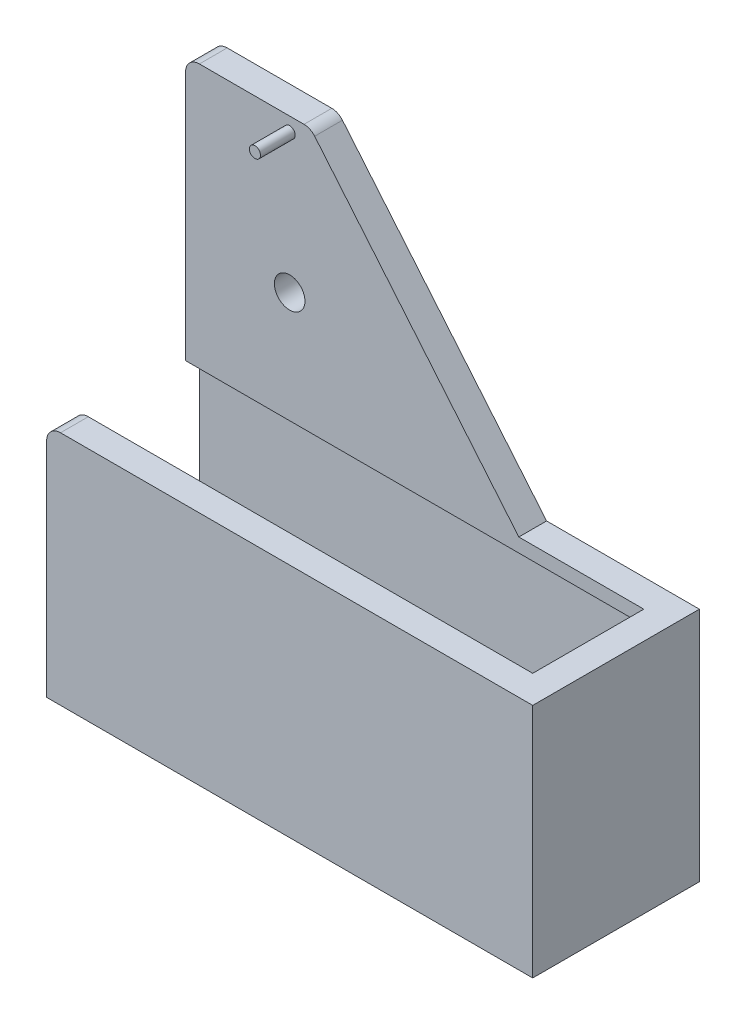
ISO-10303-21;
HEADER;
FILE_DESCRIPTION(('STEP AP214'),'2;1');
FILE_NAME('part.step','',(''),(''),'','','');
FILE_SCHEMA(('AUTOMOTIVE_DESIGN { 1 0 10303 214 1 1 1 1 }'));
ENDSEC;
DATA;
#1=APPLICATION_CONTEXT('core data for automotive mechanical design processes');
#2=APPLICATION_PROTOCOL_DEFINITION('international standard','automotive_design',2000,#1);
#3=PRODUCT_CONTEXT('',#1,'mechanical');
#4=PRODUCT('Part','Part','',(#3));
#5=PRODUCT_RELATED_PRODUCT_CATEGORY('part','',(#4));
#6=PRODUCT_DEFINITION_FORMATION('','',#4);
#7=PRODUCT_DEFINITION_CONTEXT('part definition',#1,'design');
#8=PRODUCT_DEFINITION('design','',#6,#7);
#9=PRODUCT_DEFINITION_SHAPE('','',#8);
#10=(LENGTH_UNIT() NAMED_UNIT(*) SI_UNIT(.MILLI.,.METRE.));
#11=(NAMED_UNIT(*) PLANE_ANGLE_UNIT() SI_UNIT($,.RADIAN.));
#12=(NAMED_UNIT(*) SI_UNIT($,.STERADIAN.) SOLID_ANGLE_UNIT());
#13=UNCERTAINTY_MEASURE_WITH_UNIT(LENGTH_MEASURE(1.E-05),#10,'distance_accuracy_value','');
#14=(GEOMETRIC_REPRESENTATION_CONTEXT(3) GLOBAL_UNCERTAINTY_ASSIGNED_CONTEXT((#13)) GLOBAL_UNIT_ASSIGNED_CONTEXT((#10,
#11,#12)) REPRESENTATION_CONTEXT('',''));
#15=CARTESIAN_POINT('',(0.,0.,0.));
#16=DIRECTION('',(0.,0.,1.));
#17=DIRECTION('',(1.,0.,0.));
#18=AXIS2_PLACEMENT_3D('',#15,#16,#17);
#19=CARTESIAN_POINT('',(0.,0.,0.));
#20=DIRECTION('',(0.,1.,0.));
#21=DIRECTION('',(0.,0.,1.));
#22=AXIS2_PLACEMENT_3D('',#19,#20,#21);
#23=PLANE('',#22);
#24=DIRECTION('',(0.,0.,1.));
#25=VECTOR('',#24,1.);
#26=CARTESIAN_POINT('',(-165.,0.,-60.));
#27=LINE('',#26,#25);
#28=CARTESIAN_POINT('',(-165.,0.,-50.));
#29=VERTEX_POINT('',#28);
#30=CARTESIAN_POINT('',(-165.,0.,50.));
#31=VERTEX_POINT('',#30);
#32=EDGE_CURVE('E220',#29,#31,#27,.T.);
#33=ORIENTED_EDGE('',*,*,#32,.F.);
#34=DIRECTION('',(1.,0.,0.));
#35=VECTOR('',#34,1.);
#36=CARTESIAN_POINT('',(-165.,0.,-50.));
#37=LINE('',#36,#35);
#38=CARTESIAN_POINT('',(135.,0.,-50.));
#39=VERTEX_POINT('',#38);
#40=EDGE_CURVE('E429',#29,#39,#37,.T.);
#41=ORIENTED_EDGE('',*,*,#40,.T.);
#42=DIRECTION('',(0.,0.,-1.));
#43=VECTOR('',#42,1.);
#44=CARTESIAN_POINT('',(135.,0.,50.));
#45=LINE('',#44,#43);
#46=CARTESIAN_POINT('',(135.,0.,50.));
#47=VERTEX_POINT('',#46);
#48=EDGE_CURVE('E473',#47,#39,#45,.T.);
#49=ORIENTED_EDGE('',*,*,#48,.F.);
#50=DIRECTION('',(-1.,0.,0.));
#51=VECTOR('',#50,1.);
#52=CARTESIAN_POINT('',(185.,0.,50.));
#53=LINE('',#52,#51);
#54=EDGE_CURVE('E245',#47,#31,#53,.T.);
#55=ORIENTED_EDGE('',*,*,#54,.T.);
#56=EDGE_LOOP('',(#33,#41,#49,#55));
#57=FACE_BOUND('',#56,.T.);
#58=ADVANCED_FACE('F39',(#57),#23,.F.);
#59=CARTESIAN_POINT('',(0.,120.,0.));
#60=DIRECTION('',(0.,1.,0.));
#61=DIRECTION('',(0.,0.,1.));
#62=AXIS2_PLACEMENT_3D('',#59,#60,#61);
#63=PLANE('',#62);
#64=DIRECTION('',(1.,0.,0.));
#65=VECTOR('',#64,1.);
#66=CARTESIAN_POINT('',(-165.,120.,40.));
#67=LINE('',#66,#65);
#68=CARTESIAN_POINT('',(-155.,120.,40.));
#69=VERTEX_POINT('',#68);
#70=CARTESIAN_POINT('',(165.,120.,40.));
#71=VERTEX_POINT('',#70);
#72=EDGE_CURVE('E303',#69,#71,#67,.T.);
#73=ORIENTED_EDGE('',*,*,#72,.F.);
#74=DIRECTION('',(0.,0.,1.));
#75=VECTOR('',#74,1.);
#76=CARTESIAN_POINT('',(-155.,120.,60.));
#77=LINE('',#76,#75);
#78=CARTESIAN_POINT('',(-155.,120.,60.));
#79=VERTEX_POINT('',#78);
#80=EDGE_CURVE('E259',#69,#79,#77,.T.);
#81=ORIENTED_EDGE('',*,*,#80,.T.);
#82=DIRECTION('',(1.,0.,0.));
#83=VECTOR('',#82,1.);
#84=CARTESIAN_POINT('',(-165.,120.,60.));
#85=LINE('',#84,#83);
#86=CARTESIAN_POINT('',(185.,120.,60.));
#87=VERTEX_POINT('',#86);
#88=EDGE_CURVE('E219',#79,#87,#85,.T.);
#89=ORIENTED_EDGE('',*,*,#88,.T.);
#90=DIRECTION('',(0.,0.,1.));
#91=VECTOR('',#90,1.);
#92=CARTESIAN_POINT('',(185.,120.,-60.));
#93=LINE('',#92,#91);
#94=CARTESIAN_POINT('',(185.,120.,-60.));
#95=VERTEX_POINT('',#94);
#96=EDGE_CURVE('E217',#95,#87,#93,.T.);
#97=ORIENTED_EDGE('',*,*,#96,.F.);
#98=DIRECTION('',(-1.,0.,0.));
#99=VECTOR('',#98,1.);
#100=CARTESIAN_POINT('',(-165.,120.,-60.));
#101=LINE('',#100,#99);
#102=CARTESIAN_POINT('',(75.,120.,-60.));
#103=VERTEX_POINT('',#102);
#104=EDGE_CURVE('E208',#95,#103,#101,.T.);
#105=ORIENTED_EDGE('',*,*,#104,.T.);
#106=DIRECTION('',(0.,0.,1.));
#107=VECTOR('',#106,1.);
#108=CARTESIAN_POINT('',(75.,120.,-60.));
#109=LINE('',#108,#107);
#110=CARTESIAN_POINT('',(75.,120.,-40.));
#111=VERTEX_POINT('',#110);
#112=EDGE_CURVE('E192',#103,#111,#109,.T.);
#113=ORIENTED_EDGE('',*,*,#112,.T.);
#114=DIRECTION('',(-1.,0.,0.));
#115=VECTOR('',#114,1.);
#116=CARTESIAN_POINT('',(-165.,120.,-40.));
#117=LINE('',#116,#115);
#118=CARTESIAN_POINT('',(165.,120.,-40.));
#119=VERTEX_POINT('',#118);
#120=EDGE_CURVE('E308',#119,#111,#117,.T.);
#121=ORIENTED_EDGE('',*,*,#120,.F.);
#122=DIRECTION('',(0.,0.,1.));
#123=VECTOR('',#122,1.);
#124=CARTESIAN_POINT('',(165.,120.,-60.));
#125=LINE('',#124,#123);
#126=EDGE_CURVE('E407',#119,#71,#125,.T.);
#127=ORIENTED_EDGE('',*,*,#126,.T.);
#128=EDGE_LOOP('',(#73,#81,#89,#97,#105,#113,#121,#127));
#129=FACE_BOUND('',#128,.T.);
#130=ADVANCED_FACE('F215',(#129),#63,.T.);
#131=CARTESIAN_POINT('',(-165.,110.,50.));
#132=DIRECTION('',(0.,-1.,0.));
#133=DIRECTION('',(0.,0.,-1.));
#134=AXIS2_PLACEMENT_3D('',#131,#132,#133);
#135=PLANE('',#134);
#136=DIRECTION('',(1.,0.,0.));
#137=VECTOR('',#136,1.);
#138=CARTESIAN_POINT('',(-165.,110.,40.));
#139=LINE('',#138,#137);
#140=CARTESIAN_POINT('',(-165.,110.,40.));
#141=VERTEX_POINT('',#140);
#142=CARTESIAN_POINT('',(165.,110.,40.));
#143=VERTEX_POINT('',#142);
#144=EDGE_CURVE('E314',#141,#143,#139,.T.);
#145=ORIENTED_EDGE('',*,*,#144,.T.);
#146=DIRECTION('',(0.,0.,-1.));
#147=VECTOR('',#146,1.);
#148=CARTESIAN_POINT('',(165.,110.,50.));
#149=LINE('',#148,#147);
#150=CARTESIAN_POINT('',(165.,110.,50.));
#151=VERTEX_POINT('',#150);
#152=EDGE_CURVE('E350',#151,#143,#149,.T.);
#153=ORIENTED_EDGE('',*,*,#152,.F.);
#154=DIRECTION('',(1.,0.,0.));
#155=VECTOR('',#154,1.);
#156=CARTESIAN_POINT('',(-165.,110.,50.));
#157=LINE('',#156,#155);
#158=CARTESIAN_POINT('',(-165.,110.,50.));
#159=VERTEX_POINT('',#158);
#160=EDGE_CURVE('E359',#159,#151,#157,.T.);
#161=ORIENTED_EDGE('',*,*,#160,.F.);
#162=DIRECTION('',(0.,0.,-1.));
#163=VECTOR('',#162,1.);
#164=CARTESIAN_POINT('',(-165.,110.,50.));
#165=LINE('',#164,#163);
#166=EDGE_CURVE('E338',#159,#141,#165,.T.);
#167=ORIENTED_EDGE('',*,*,#166,.T.);
#168=EDGE_LOOP('',(#145,#153,#161,#167));
#169=FACE_BOUND('',#168,.T.);
#170=ADVANCED_FACE('F398',(#169),#135,.T.);
#171=CARTESIAN_POINT('',(-165.,120.,-60.));
#172=DIRECTION('',(0.,0.,1.));
#173=DIRECTION('',(1.,0.,0.));
#174=AXIS2_PLACEMENT_3D('',#171,#172,#173);
#175=PLANE('',#174);
#176=DIRECTION('',(0.,-1.,0.));
#177=VECTOR('',#176,1.);
#178=CARTESIAN_POINT('',(-165.,120.,-60.));
#179=LINE('',#178,#177);
#180=CARTESIAN_POINT('',(-165.,290.,-60.));
#181=VERTEX_POINT('',#180);
#182=CARTESIAN_POINT('',(-165.,-50.,-60.));
#183=VERTEX_POINT('',#182);
#184=EDGE_CURVE('E238',#181,#183,#179,.T.);
#185=ORIENTED_EDGE('',*,*,#184,.F.);
#186=CARTESIAN_POINT('',(-155.,290.,-60.));
#187=DIRECTION('',(0.,0.,1.));
#188=DIRECTION('',(1.,0.,0.));
#189=AXIS2_PLACEMENT_3D('',#186,#187,#188);
#190=CIRCLE('',#189,10.);
#191=CARTESIAN_POINT('',(-155.,300.,-60.));
#192=VERTEX_POINT('',#191);
#193=EDGE_CURVE('E11',#181,#192,#190,.F.);
#194=ORIENTED_EDGE('',*,*,#193,.T.);
#195=DIRECTION('',(-1.,0.,0.));
#196=VECTOR('',#195,1.);
#197=CARTESIAN_POINT('',(-115.,300.,-60.));
#198=LINE('',#197,#196);
#199=CARTESIAN_POINT('',(-79.6837494598444,300.,-60.));
#200=VERTEX_POINT('',#199);
#201=EDGE_CURVE('E300',#200,#192,#198,.T.);
#202=ORIENTED_EDGE('',*,*,#201,.F.);
#203=CARTESIAN_POINT('',(-79.6837494598444,290.,-60.));
#204=DIRECTION('',(0.,0.,1.));
#205=DIRECTION('',(1.,0.,0.));
#206=AXIS2_PLACEMENT_3D('',#203,#204,#205);
#207=CIRCLE('',#206,10.);
#208=CARTESIAN_POINT('',(-72.0015366638707,296.401843996645,-60.));
#209=VERTEX_POINT('',#208);
#210=EDGE_CURVE('E210',#200,#209,#207,.F.);
#211=ORIENTED_EDGE('',*,*,#210,.T.);
#212=DIRECTION('',(-0.64018439966448,0.768221279597376,0.));
#213=VECTOR('',#212,1.);
#214=CARTESIAN_POINT('',(-75.,300.,-60.));
#215=LINE('',#214,#213);
#216=EDGE_CURVE('E195',#103,#209,#215,.T.);
#217=ORIENTED_EDGE('',*,*,#216,.F.);
#218=ORIENTED_EDGE('',*,*,#104,.F.);
#219=DIRECTION('',(0.,1.,0.));
#220=VECTOR('',#219,1.);
#221=CARTESIAN_POINT('',(185.,0.,-60.));
#222=LINE('',#221,#220);
#223=CARTESIAN_POINT('',(185.,-50.,-60.));
#224=VERTEX_POINT('',#223);
#225=EDGE_CURVE('E488',#224,#95,#222,.T.);
#226=ORIENTED_EDGE('',*,*,#225,.F.);
#227=DIRECTION('',(1.,0.,0.));
#228=VECTOR('',#227,1.);
#229=CARTESIAN_POINT('',(-165.,-50.,-60.));
#230=LINE('',#229,#228);
#231=EDGE_CURVE('E443',#183,#224,#230,.T.);
#232=ORIENTED_EDGE('',*,*,#231,.F.);
#233=EDGE_LOOP('',(#185,#194,#202,#211,#217,#218,#226,#232));
#234=FACE_BOUND('',#233,.T.);
#235=CARTESIAN_POINT('',(-90.,190.,-60.));
#236=DIRECTION('',(0.,0.,1.));
#237=DIRECTION('',(1.,0.,0.));
#238=AXIS2_PLACEMENT_3D('',#235,#236,#237);
#239=CIRCLE('',#238,11.);
#240=CARTESIAN_POINT('',(-79.,190.,-60.));
#241=VERTEX_POINT('',#240);
#242=EDGE_CURVE('E859',#241,#241,#239,.T.);
#243=ORIENTED_EDGE('',*,*,#242,.T.);
#244=EDGE_LOOP('',(#243));
#245=FACE_BOUND('',#244,.T.);
#246=ADVANCED_FACE('F206',(#234,#245),#175,.F.);
#247=CARTESIAN_POINT('',(-165.,120.,-60.));
#248=DIRECTION('',(1.,0.,0.));
#249=DIRECTION('',(0.,0.,-1.));
#250=AXIS2_PLACEMENT_3D('',#247,#248,#249);
#251=PLANE('',#250);
#252=DIRECTION('',(0.,-1.,0.));
#253=VECTOR('',#252,1.);
#254=CARTESIAN_POINT('',(-165.,120.,60.));
#255=LINE('',#254,#253);
#256=CARTESIAN_POINT('',(-165.,110.,60.));
#257=VERTEX_POINT('',#256);
#258=CARTESIAN_POINT('',(-165.,-50.,60.));
#259=VERTEX_POINT('',#258);
#260=EDGE_CURVE('E226',#257,#259,#255,.T.);
#261=ORIENTED_EDGE('',*,*,#260,.F.);
#262=DIRECTION('',(0.,0.,1.));
#263=VECTOR('',#262,1.);
#264=CARTESIAN_POINT('',(-165.,110.,40.));
#265=LINE('',#264,#263);
#266=EDGE_CURVE('E269',#257,#159,#265,.F.);
#267=ORIENTED_EDGE('',*,*,#266,.T.);
#268=DIRECTION('',(0.,-1.,0.));
#269=VECTOR('',#268,1.);
#270=CARTESIAN_POINT('',(-165.,110.,50.));
#271=LINE('',#270,#269);
#272=CARTESIAN_POINT('',(-165.,10.,50.));
#273=VERTEX_POINT('',#272);
#274=EDGE_CURVE('E342',#159,#273,#271,.T.);
#275=ORIENTED_EDGE('',*,*,#274,.T.);
#276=DIRECTION('',(0.,0.,-1.));
#277=VECTOR('',#276,1.);
#278=CARTESIAN_POINT('',(-165.,10.,50.));
#279=LINE('',#278,#277);
#280=CARTESIAN_POINT('',(-165.,10.,-50.0000000000001));
#281=VERTEX_POINT('',#280);
#282=EDGE_CURVE('E330',#273,#281,#279,.T.);
#283=ORIENTED_EDGE('',*,*,#282,.T.);
#284=DIRECTION('',(0.,-1.,0.));
#285=VECTOR('',#284,1.);
#286=CARTESIAN_POINT('',(-165.,110.,-50.));
#287=LINE('',#286,#285);
#288=CARTESIAN_POINT('',(-165.,110.,-50.));
#289=VERTEX_POINT('',#288);
#290=EDGE_CURVE('E334',#289,#281,#287,.T.);
#291=ORIENTED_EDGE('',*,*,#290,.F.);
#292=CARTESIAN_POINT('',(-165.,110.,-40.));
#293=VERTEX_POINT('',#292);
#294=EDGE_CURVE('E293',#293,#289,#165,.T.);
#295=ORIENTED_EDGE('',*,*,#294,.F.);
#296=DIRECTION('',(0.,1.,0.));
#297=VECTOR('',#296,1.);
#298=CARTESIAN_POINT('',(-165.,-0.001000000000001,-40.));
#299=LINE('',#298,#297);
#300=CARTESIAN_POINT('',(-165.,290.,-40.));
#301=VERTEX_POINT('',#300);
#302=EDGE_CURVE('E285',#293,#301,#299,.T.);
#303=ORIENTED_EDGE('',*,*,#302,.T.);
#304=DIRECTION('',(0.,0.,1.));
#305=VECTOR('',#304,1.);
#306=CARTESIAN_POINT('',(-165.,290.,-60.));
#307=LINE('',#306,#305);
#308=EDGE_CURVE('E266',#301,#181,#307,.F.);
#309=ORIENTED_EDGE('',*,*,#308,.T.);
#310=ORIENTED_EDGE('',*,*,#184,.T.);
#311=DIRECTION('',(0.,0.,1.));
#312=VECTOR('',#311,1.);
#313=CARTESIAN_POINT('',(-165.,-50.,-60.));
#314=LINE('',#313,#312);
#315=CARTESIAN_POINT('',(-165.,-50.,-50.));
#316=VERTEX_POINT('',#315);
#317=EDGE_CURVE('E439',#183,#316,#314,.T.);
#318=ORIENTED_EDGE('',*,*,#317,.T.);
#319=DIRECTION('',(0.,1.,0.));
#320=VECTOR('',#319,1.);
#321=CARTESIAN_POINT('',(-165.,-50.,-50.));
#322=LINE('',#321,#320);
#323=EDGE_CURVE('E451',#316,#29,#322,.T.);
#324=ORIENTED_EDGE('',*,*,#323,.T.);
#325=ORIENTED_EDGE('',*,*,#32,.T.);
#326=DIRECTION('',(0.,1.,0.));
#327=VECTOR('',#326,1.);
#328=CARTESIAN_POINT('',(-165.,-50.,50.));
#329=LINE('',#328,#327);
#330=CARTESIAN_POINT('',(-165.,-50.,50.));
#331=VERTEX_POINT('',#330);
#332=EDGE_CURVE('E416',#331,#31,#329,.T.);
#333=ORIENTED_EDGE('',*,*,#332,.F.);
#334=DIRECTION('',(0.,0.,1.));
#335=VECTOR('',#334,1.);
#336=CARTESIAN_POINT('',(-165.,-50.,50.));
#337=LINE('',#336,#335);
#338=EDGE_CURVE('E415',#331,#259,#337,.T.);
#339=ORIENTED_EDGE('',*,*,#338,.T.);
#340=EDGE_LOOP('',(#261,#267,#275,#283,#291,#295,#303,#309,#310,#318,#324,#325,#333,#339));
#341=FACE_BOUND('',#340,.T.);
#342=ADVANCED_FACE('F291',(#341),#251,.F.);
#343=CARTESIAN_POINT('',(-165.,120.,60.));
#344=DIRECTION('',(0.,0.,-1.));
#345=DIRECTION('',(-1.,0.,0.));
#346=AXIS2_PLACEMENT_3D('',#343,#344,#345);
#347=PLANE('',#346);
#348=ORIENTED_EDGE('',*,*,#88,.F.);
#349=CARTESIAN_POINT('',(-155.,110.,60.));
#350=DIRECTION('',(0.,0.,-1.));
#351=DIRECTION('',(-1.,0.,0.));
#352=AXIS2_PLACEMENT_3D('',#349,#350,#351);
#353=CIRCLE('',#352,10.);
#354=EDGE_CURVE('E263',#79,#257,#353,.F.);
#355=ORIENTED_EDGE('',*,*,#354,.T.);
#356=ORIENTED_EDGE('',*,*,#260,.T.);
#357=DIRECTION('',(-1.,0.,0.));
#358=VECTOR('',#357,1.);
#359=CARTESIAN_POINT('',(185.,-50.,60.));
#360=LINE('',#359,#358);
#361=CARTESIAN_POINT('',(185.,-50.,60.));
#362=VERTEX_POINT('',#361);
#363=EDGE_CURVE('E422',#362,#259,#360,.T.);
#364=ORIENTED_EDGE('',*,*,#363,.F.);
#365=DIRECTION('',(0.,1.,0.));
#366=VECTOR('',#365,1.);
#367=CARTESIAN_POINT('',(185.,0.,60.));
#368=LINE('',#367,#366);
#369=EDGE_CURVE('E487',#362,#87,#368,.T.);
#370=ORIENTED_EDGE('',*,*,#369,.T.);
#371=EDGE_LOOP('',(#348,#355,#356,#364,#370));
#372=FACE_BOUND('',#371,.T.);
#373=ADVANCED_FACE('F409',(#372),#347,.F.);
#374=DIRECTION('',(0.,0.,1.));
#375=VECTOR('',#374,1.);
#376=CARTESIAN_POINT('',(165.,0.,50.));
#377=LINE('',#376,#375);
#378=CARTESIAN_POINT('',(165.,0.,-50.));
#379=VERTEX_POINT('',#378);
#380=CARTESIAN_POINT('',(165.,0.,50.));
#381=VERTEX_POINT('',#380);
#382=EDGE_CURVE('E476',#379,#381,#377,.T.);
#383=ORIENTED_EDGE('',*,*,#382,.F.);
#384=CARTESIAN_POINT('',(175.,0.,-50.));
#385=VERTEX_POINT('',#384);
#386=EDGE_CURVE('E249',#379,#385,#37,.T.);
#387=ORIENTED_EDGE('',*,*,#386,.T.);
#388=DIRECTION('',(0.,0.,1.));
#389=VECTOR('',#388,1.);
#390=CARTESIAN_POINT('',(175.,0.,-60.));
#391=LINE('',#390,#389);
#392=CARTESIAN_POINT('',(175.,0.,50.));
#393=VERTEX_POINT('',#392);
#394=EDGE_CURVE('E454',#385,#393,#391,.T.);
#395=ORIENTED_EDGE('',*,*,#394,.T.);
#396=EDGE_CURVE('E204',#393,#381,#53,.T.);
#397=ORIENTED_EDGE('',*,*,#396,.T.);
#398=EDGE_LOOP('',(#383,#387,#395,#397));
#399=FACE_BOUND('',#398,.T.);
#400=ADVANCED_FACE('F518',(#399),#23,.F.);
#401=CARTESIAN_POINT('',(-165.,10.,50.));
#402=DIRECTION('',(0.,-1.,0.));
#403=DIRECTION('',(0.,0.,-1.));
#404=AXIS2_PLACEMENT_3D('',#401,#402,#403);
#405=PLANE('',#404);
#406=DIRECTION('',(1.,0.,0.));
#407=VECTOR('',#406,1.);
#408=CARTESIAN_POINT('',(-165.,10.,50.));
#409=LINE('',#408,#407);
#410=CARTESIAN_POINT('',(135.,10.0000000000001,50.));
#411=VERTEX_POINT('',#410);
#412=EDGE_CURVE('E230',#273,#411,#409,.T.);
#413=ORIENTED_EDGE('',*,*,#412,.T.);
#414=DIRECTION('',(0.,0.,1.));
#415=VECTOR('',#414,1.);
#416=CARTESIAN_POINT('',(135.,10.,50.));
#417=LINE('',#416,#415);
#418=CARTESIAN_POINT('',(135.,10.0000000000001,-50.));
#419=VERTEX_POINT('',#418);
#420=EDGE_CURVE('E385',#419,#411,#417,.T.);
#421=ORIENTED_EDGE('',*,*,#420,.F.);
#422=DIRECTION('',(1.,0.,0.));
#423=VECTOR('',#422,1.);
#424=CARTESIAN_POINT('',(-165.,10.,-50.0000000000001));
#425=LINE('',#424,#423);
#426=EDGE_CURVE('E233',#281,#419,#425,.T.);
#427=ORIENTED_EDGE('',*,*,#426,.F.);
#428=ORIENTED_EDGE('',*,*,#282,.F.);
#429=EDGE_LOOP('',(#413,#421,#427,#428));
#430=FACE_BOUND('',#429,.T.);
#431=ADVANCED_FACE('F383',(#430),#405,.F.);
#432=CARTESIAN_POINT('',(-165.,110.,50.));
#433=DIRECTION('',(0.,0.,1.));
#434=DIRECTION('',(0.,-1.,0.));
#435=AXIS2_PLACEMENT_3D('',#432,#433,#434);
#436=PLANE('',#435);
#437=DIRECTION('',(0.,-1.,0.));
#438=VECTOR('',#437,1.);
#439=CARTESIAN_POINT('',(165.,110.,50.));
#440=LINE('',#439,#438);
#441=EDGE_CURVE('E335',#151,#381,#440,.T.);
#442=ORIENTED_EDGE('',*,*,#441,.T.);
#443=ORIENTED_EDGE('',*,*,#396,.F.);
#444=DIRECTION('',(0.,1.,0.));
#445=VECTOR('',#444,1.);
#446=CARTESIAN_POINT('',(175.,-50.,50.));
#447=LINE('',#446,#445);
#448=CARTESIAN_POINT('',(175.,-50.,50.));
#449=VERTEX_POINT('',#448);
#450=EDGE_CURVE('E465',#449,#393,#447,.T.);
#451=ORIENTED_EDGE('',*,*,#450,.F.);
#452=DIRECTION('',(-1.,0.,0.));
#453=VECTOR('',#452,1.);
#454=CARTESIAN_POINT('',(185.,-50.,50.));
#455=LINE('',#454,#453);
#456=EDGE_CURVE('E421',#449,#331,#455,.T.);
#457=ORIENTED_EDGE('',*,*,#456,.T.);
#458=ORIENTED_EDGE('',*,*,#332,.T.);
#459=ORIENTED_EDGE('',*,*,#54,.F.);
#460=DIRECTION('',(0.,-1.,0.));
#461=VECTOR('',#460,1.);
#462=CARTESIAN_POINT('',(135.,300.001,50.));
#463=LINE('',#462,#461);
#464=EDGE_CURVE('E472',#411,#47,#463,.T.);
#465=ORIENTED_EDGE('',*,*,#464,.F.);
#466=ORIENTED_EDGE('',*,*,#412,.F.);
#467=ORIENTED_EDGE('',*,*,#274,.F.);
#468=ORIENTED_EDGE('',*,*,#160,.T.);
#469=EDGE_LOOP('',(#442,#443,#451,#457,#458,#459,#465,#466,#467,#468));
#470=FACE_BOUND('',#469,.T.);
#471=ADVANCED_FACE('F391',(#470),#436,.F.);
#472=DIRECTION('',(-1.,0.,0.));
#473=VECTOR('',#472,1.);
#474=CARTESIAN_POINT('',(-165.,110.,-40.));
#475=LINE('',#474,#473);
#476=CARTESIAN_POINT('',(165.,110.,-40.));
#477=VERTEX_POINT('',#476);
#478=EDGE_CURVE('E296',#477,#293,#475,.T.);
#479=ORIENTED_EDGE('',*,*,#478,.T.);
#480=ORIENTED_EDGE('',*,*,#294,.T.);
#481=DIRECTION('',(1.,0.,0.));
#482=VECTOR('',#481,1.);
#483=CARTESIAN_POINT('',(-165.,110.,-50.));
#484=LINE('',#483,#482);
#485=CARTESIAN_POINT('',(165.,110.,-50.));
#486=VERTEX_POINT('',#485);
#487=EDGE_CURVE('E362',#289,#486,#484,.T.);
#488=ORIENTED_EDGE('',*,*,#487,.T.);
#489=EDGE_CURVE('E349',#477,#486,#149,.T.);
#490=ORIENTED_EDGE('',*,*,#489,.F.);
#491=EDGE_LOOP('',(#479,#480,#488,#490));
#492=FACE_BOUND('',#491,.T.);
#493=ADVANCED_FACE('F512',(#492),#135,.T.);
#494=CARTESIAN_POINT('',(-165.,110.,-50.));
#495=DIRECTION('',(0.,0.,1.));
#496=DIRECTION('',(0.,-1.,0.));
#497=AXIS2_PLACEMENT_3D('',#494,#495,#496);
#498=PLANE('',#497);
#499=DIRECTION('',(0.,-1.,0.));
#500=VECTOR('',#499,1.);
#501=CARTESIAN_POINT('',(165.,110.,-50.));
#502=LINE('',#501,#500);
#503=EDGE_CURVE('E295',#486,#379,#502,.T.);
#504=ORIENTED_EDGE('',*,*,#503,.F.);
#505=ORIENTED_EDGE('',*,*,#487,.F.);
#506=ORIENTED_EDGE('',*,*,#290,.T.);
#507=ORIENTED_EDGE('',*,*,#426,.T.);
#508=DIRECTION('',(0.,-1.,0.));
#509=VECTOR('',#508,1.);
#510=CARTESIAN_POINT('',(135.,300.001,-50.));
#511=LINE('',#510,#509);
#512=EDGE_CURVE('E378',#419,#39,#511,.T.);
#513=ORIENTED_EDGE('',*,*,#512,.T.);
#514=ORIENTED_EDGE('',*,*,#40,.F.);
#515=ORIENTED_EDGE('',*,*,#323,.F.);
#516=DIRECTION('',(1.,0.,0.));
#517=VECTOR('',#516,1.);
#518=CARTESIAN_POINT('',(-165.,-50.,-50.));
#519=LINE('',#518,#517);
#520=CARTESIAN_POINT('',(175.,-50.,-50.));
#521=VERTEX_POINT('',#520);
#522=EDGE_CURVE('E435',#316,#521,#519,.T.);
#523=ORIENTED_EDGE('',*,*,#522,.T.);
#524=DIRECTION('',(0.,1.,0.));
#525=VECTOR('',#524,1.);
#526=CARTESIAN_POINT('',(175.,-50.,-50.));
#527=LINE('',#526,#525);
#528=EDGE_CURVE('E462',#521,#385,#527,.T.);
#529=ORIENTED_EDGE('',*,*,#528,.T.);
#530=ORIENTED_EDGE('',*,*,#386,.F.);
#531=EDGE_LOOP('',(#504,#505,#506,#507,#513,#514,#515,#523,#529,#530));
#532=FACE_BOUND('',#531,.T.);
#533=ADVANCED_FACE('F376',(#532),#498,.T.);
#534=CARTESIAN_POINT('',(-165.,-0.001000000000001,-40.));
#535=DIRECTION('',(0.,0.,-1.));
#536=DIRECTION('',(-1.,0.,0.));
#537=AXIS2_PLACEMENT_3D('',#534,#535,#536);
#538=PLANE('',#537);
#539=DIRECTION('',(1.,0.,0.));
#540=VECTOR('',#539,1.);
#541=CARTESIAN_POINT('',(-75.,300.,-40.));
#542=LINE('',#541,#540);
#543=CARTESIAN_POINT('',(-155.,300.,-40.));
#544=VERTEX_POINT('',#543);
#545=CARTESIAN_POINT('',(-79.6837494598444,300.,-40.));
#546=VERTEX_POINT('',#545);
#547=EDGE_CURVE('E287',#544,#546,#542,.T.);
#548=ORIENTED_EDGE('',*,*,#547,.F.);
#549=CARTESIAN_POINT('',(-155.,290.,-40.));
#550=DIRECTION('',(0.,0.,-1.));
#551=DIRECTION('',(-1.,0.,0.));
#552=AXIS2_PLACEMENT_3D('',#549,#550,#551);
#553=CIRCLE('',#552,10.);
#554=EDGE_CURVE('E48',#544,#301,#553,.F.);
#555=ORIENTED_EDGE('',*,*,#554,.T.);
#556=ORIENTED_EDGE('',*,*,#302,.F.);
#557=ORIENTED_EDGE('',*,*,#478,.F.);
#558=DIRECTION('',(0.,1.,0.));
#559=VECTOR('',#558,1.);
#560=CARTESIAN_POINT('',(165.,-0.001000000000001,-40.));
#561=LINE('',#560,#559);
#562=EDGE_CURVE('E322',#477,#119,#561,.T.);
#563=ORIENTED_EDGE('',*,*,#562,.T.);
#564=ORIENTED_EDGE('',*,*,#120,.T.);
#565=DIRECTION('',(-0.64018439966448,0.768221279597376,0.));
#566=VECTOR('',#565,1.);
#567=CARTESIAN_POINT('',(-75.,300.,-40.));
#568=LINE('',#567,#566);
#569=CARTESIAN_POINT('',(-72.0015366638707,296.401843996645,-40.));
#570=VERTEX_POINT('',#569);
#571=EDGE_CURVE('E198',#111,#570,#568,.T.);
#572=ORIENTED_EDGE('',*,*,#571,.T.);
#573=CARTESIAN_POINT('',(-79.6837494598444,290.,-40.));
#574=DIRECTION('',(0.,0.,-1.));
#575=DIRECTION('',(-1.,0.,0.));
#576=AXIS2_PLACEMENT_3D('',#573,#574,#575);
#577=CIRCLE('',#576,10.);
#578=EDGE_CURVE('E255',#570,#546,#577,.F.);
#579=ORIENTED_EDGE('',*,*,#578,.T.);
#580=EDGE_LOOP('',(#548,#555,#556,#557,#563,#564,#572,#579));
#581=FACE_BOUND('',#580,.T.);
#582=CARTESIAN_POINT('',(-90.,190.,-40.));
#583=DIRECTION('',(0.,0.,1.));
#584=DIRECTION('',(1.,0.,0.));
#585=AXIS2_PLACEMENT_3D('',#582,#583,#584);
#586=CIRCLE('',#585,11.);
#587=CARTESIAN_POINT('',(-79.,190.,-40.));
#588=VERTEX_POINT('',#587);
#589=EDGE_CURVE('E864',#588,#588,#586,.T.);
#590=ORIENTED_EDGE('',*,*,#589,.F.);
#591=EDGE_LOOP('',(#590));
#592=FACE_BOUND('',#591,.T.);
#593=CARTESIAN_POINT('',(-90.,290.,-40.));
#594=DIRECTION('',(0.,0.,-1.));
#595=DIRECTION('',(-1.,0.,0.));
#596=AXIS2_PLACEMENT_3D('',#593,#594,#595);
#597=CIRCLE('',#596,4.00000000000001);
#598=CARTESIAN_POINT('',(-94.,290.,-40.));
#599=VERTEX_POINT('',#598);
#600=EDGE_CURVE('E241',#599,#599,#597,.F.);
#601=ORIENTED_EDGE('',*,*,#600,.F.);
#602=EDGE_LOOP('',(#601));
#603=FACE_BOUND('',#602,.T.);
#604=ADVANCED_FACE('F282',(#581,#592,#603),#538,.F.);
#605=CARTESIAN_POINT('',(-165.,-0.001000000000001,40.));
#606=DIRECTION('',(0.,0.,1.));
#607=DIRECTION('',(1.,0.,0.));
#608=AXIS2_PLACEMENT_3D('',#605,#606,#607);
#609=PLANE('',#608);
#610=ORIENTED_EDGE('',*,*,#144,.F.);
#611=CARTESIAN_POINT('',(-155.,110.,40.));
#612=DIRECTION('',(0.,0.,1.));
#613=DIRECTION('',(1.,0.,0.));
#614=AXIS2_PLACEMENT_3D('',#611,#612,#613);
#615=CIRCLE('',#614,10.);
#616=EDGE_CURVE('E272',#141,#69,#615,.F.);
#617=ORIENTED_EDGE('',*,*,#616,.T.);
#618=ORIENTED_EDGE('',*,*,#72,.T.);
#619=DIRECTION('',(0.,1.,0.));
#620=VECTOR('',#619,1.);
#621=CARTESIAN_POINT('',(165.,-0.001000000000001,40.));
#622=LINE('',#621,#620);
#623=EDGE_CURVE('E318',#143,#71,#622,.T.);
#624=ORIENTED_EDGE('',*,*,#623,.F.);
#625=EDGE_LOOP('',(#610,#617,#618,#624));
#626=FACE_BOUND('',#625,.T.);
#627=ADVANCED_FACE('F405',(#626),#609,.F.);
#628=CARTESIAN_POINT('',(0.,300.,0.));
#629=DIRECTION('',(0.,-1.,0.));
#630=DIRECTION('',(0.,0.,-1.));
#631=AXIS2_PLACEMENT_3D('',#628,#629,#630);
#632=PLANE('',#631);
#633=ORIENTED_EDGE('',*,*,#201,.T.);
#634=DIRECTION('',(0.,0.,1.));
#635=VECTOR('',#634,1.);
#636=CARTESIAN_POINT('',(-155.,300.,0.));
#637=LINE('',#636,#635);
#638=EDGE_CURVE('E275',#192,#544,#637,.T.);
#639=ORIENTED_EDGE('',*,*,#638,.T.);
#640=ORIENTED_EDGE('',*,*,#547,.T.);
#641=DIRECTION('',(0.,0.,-1.));
#642=VECTOR('',#641,1.);
#643=CARTESIAN_POINT('',(-79.6837494598444,300.,-60.));
#644=LINE('',#643,#642);
#645=EDGE_CURVE('E246',#546,#200,#644,.T.);
#646=ORIENTED_EDGE('',*,*,#645,.T.);
#647=EDGE_LOOP('',(#633,#639,#640,#646));
#648=FACE_BOUND('',#647,.T.);
#649=ADVANCED_FACE('F299',(#648),#632,.F.);
#650=CARTESIAN_POINT('',(-90.,290.,-15.));
#651=DIRECTION('',(0.,0.,-1.));
#652=DIRECTION('',(-1.,0.,0.));
#653=AXIS2_PLACEMENT_3D('',#650,#651,#652);
#654=CYLINDRICAL_SURFACE('',#653,4.00000000000001);
#655=CARTESIAN_POINT('',(-90.,290.,-15.));
#656=DIRECTION('',(0.,0.,1.));
#657=DIRECTION('',(1.,0.,0.));
#658=AXIS2_PLACEMENT_3D('',#655,#656,#657);
#659=CIRCLE('',#658,4.00000000000001);
#660=CARTESIAN_POINT('',(-86.,290.,-15.));
#661=VERTEX_POINT('',#660);
#662=EDGE_CURVE('E310',#661,#661,#659,.T.);
#663=ORIENTED_EDGE('',*,*,#662,.F.);
#664=EDGE_LOOP('',(#663));
#665=FACE_BOUND('',#664,.T.);
#666=ORIENTED_EDGE('',*,*,#600,.T.);
#667=EDGE_LOOP('',(#666));
#668=FACE_BOUND('',#667,.T.);
#669=ADVANCED_FACE('F499',(#665,#668),#654,.T.);
#670=CARTESIAN_POINT('',(0.,0.,-15.));
#671=DIRECTION('',(0.,0.,1.));
#672=DIRECTION('',(1.,0.,0.));
#673=AXIS2_PLACEMENT_3D('',#670,#671,#672);
#674=PLANE('',#673);
#675=ORIENTED_EDGE('',*,*,#662,.T.);
#676=EDGE_LOOP('',(#675));
#677=FACE_BOUND('',#676,.T.);
#678=ADVANCED_FACE('F497',(#677),#674,.T.);
#679=CARTESIAN_POINT('',(165.,0.,-60.));
#680=DIRECTION('',(-1.,0.,0.));
#681=DIRECTION('',(0.,0.,1.));
#682=AXIS2_PLACEMENT_3D('',#679,#680,#681);
#683=PLANE('',#682);
#684=ORIENTED_EDGE('',*,*,#152,.T.);
#685=ORIENTED_EDGE('',*,*,#623,.T.);
#686=ORIENTED_EDGE('',*,*,#126,.F.);
#687=ORIENTED_EDGE('',*,*,#562,.F.);
#688=ORIENTED_EDGE('',*,*,#489,.T.);
#689=ORIENTED_EDGE('',*,*,#503,.T.);
#690=ORIENTED_EDGE('',*,*,#382,.T.);
#691=ORIENTED_EDGE('',*,*,#441,.F.);
#692=EDGE_LOOP('',(#684,#685,#686,#687,#688,#689,#690,#691));
#693=FACE_BOUND('',#692,.T.);
#694=ADVANCED_FACE('F401',(#693),#683,.T.);
#695=CARTESIAN_POINT('',(185.,0.,-60.));
#696=DIRECTION('',(-1.,0.,0.));
#697=DIRECTION('',(0.,0.,1.));
#698=AXIS2_PLACEMENT_3D('',#695,#696,#697);
#699=PLANE('',#698);
#700=ORIENTED_EDGE('',*,*,#96,.T.);
#701=ORIENTED_EDGE('',*,*,#369,.F.);
#702=DIRECTION('',(0.,0.,1.));
#703=VECTOR('',#702,1.);
#704=CARTESIAN_POINT('',(185.,-50.,-60.));
#705=LINE('',#704,#703);
#706=EDGE_CURVE('E447',#224,#362,#705,.T.);
#707=ORIENTED_EDGE('',*,*,#706,.F.);
#708=ORIENTED_EDGE('',*,*,#225,.T.);
#709=EDGE_LOOP('',(#700,#701,#707,#708));
#710=FACE_BOUND('',#709,.T.);
#711=ADVANCED_FACE('F556',(#710),#699,.F.);
#712=CARTESIAN_POINT('',(135.,300.001,50.));
#713=DIRECTION('',(-1.,0.,0.));
#714=DIRECTION('',(0.,0.,1.));
#715=AXIS2_PLACEMENT_3D('',#712,#713,#714);
#716=PLANE('',#715);
#717=ORIENTED_EDGE('',*,*,#420,.T.);
#718=ORIENTED_EDGE('',*,*,#464,.T.);
#719=ORIENTED_EDGE('',*,*,#48,.T.);
#720=ORIENTED_EDGE('',*,*,#512,.F.);
#721=EDGE_LOOP('',(#717,#718,#719,#720));
#722=FACE_BOUND('',#721,.T.);
#723=ADVANCED_FACE('F549',(#722),#716,.F.);
#724=CARTESIAN_POINT('',(175.,-50.,-60.));
#725=DIRECTION('',(-1.,0.,0.));
#726=DIRECTION('',(0.,0.,1.));
#727=AXIS2_PLACEMENT_3D('',#724,#725,#726);
#728=PLANE('',#727);
#729=ORIENTED_EDGE('',*,*,#394,.F.);
#730=ORIENTED_EDGE('',*,*,#528,.F.);
#731=DIRECTION('',(0.,0.,1.));
#732=VECTOR('',#731,1.);
#733=CARTESIAN_POINT('',(175.,-50.,-60.));
#734=LINE('',#733,#732);
#735=EDGE_CURVE('E426',#521,#449,#734,.T.);
#736=ORIENTED_EDGE('',*,*,#735,.T.);
#737=ORIENTED_EDGE('',*,*,#450,.T.);
#738=EDGE_LOOP('',(#729,#730,#736,#737));
#739=FACE_BOUND('',#738,.T.);
#740=ADVANCED_FACE('F547',(#739),#728,.T.);
#741=CARTESIAN_POINT('',(0.,-50.,0.));
#742=DIRECTION('',(0.,1.,0.));
#743=DIRECTION('',(-1.,0.,0.));
#744=AXIS2_PLACEMENT_3D('',#741,#742,#743);
#745=PLANE('',#744);
#746=ORIENTED_EDGE('',*,*,#363,.T.);
#747=ORIENTED_EDGE('',*,*,#338,.F.);
#748=ORIENTED_EDGE('',*,*,#456,.F.);
#749=ORIENTED_EDGE('',*,*,#735,.F.);
#750=ORIENTED_EDGE('',*,*,#522,.F.);
#751=ORIENTED_EDGE('',*,*,#317,.F.);
#752=ORIENTED_EDGE('',*,*,#231,.T.);
#753=ORIENTED_EDGE('',*,*,#706,.T.);
#754=EDGE_LOOP('',(#746,#747,#748,#749,#750,#751,#752,#753));
#755=FACE_BOUND('',#754,.T.);
#756=ADVANCED_FACE('F545',(#755),#745,.F.);
#757=CARTESIAN_POINT('',(-75.,300.,-60.));
#758=DIRECTION('',(0.768221279597376,0.64018439966448,0.));
#759=DIRECTION('',(-0.64018439966448,0.768221279597376,0.));
#760=AXIS2_PLACEMENT_3D('',#757,#758,#759);
#761=PLANE('',#760);
#762=ORIENTED_EDGE('',*,*,#216,.T.);
#763=DIRECTION('',(0.,0.,-1.));
#764=VECTOR('',#763,1.);
#765=CARTESIAN_POINT('',(-72.0015366638707,296.401843996645,-40.));
#766=LINE('',#765,#764);
#767=EDGE_CURVE('E252',#209,#570,#766,.F.);
#768=ORIENTED_EDGE('',*,*,#767,.T.);
#769=ORIENTED_EDGE('',*,*,#571,.F.);
#770=ORIENTED_EDGE('',*,*,#112,.F.);
#771=EDGE_LOOP('',(#762,#768,#769,#770));
#772=FACE_BOUND('',#771,.T.);
#773=ADVANCED_FACE('F194',(#772),#761,.T.);
#774=CARTESIAN_POINT('',(-79.6837494598444,290.,0.));
#775=DIRECTION('',(0.,0.,1.));
#776=DIRECTION('',(1.,0.,0.));
#777=AXIS2_PLACEMENT_3D('',#774,#775,#776);
#778=CYLINDRICAL_SURFACE('',#777,10.);
#779=ORIENTED_EDGE('',*,*,#578,.F.);
#780=ORIENTED_EDGE('',*,*,#767,.F.);
#781=ORIENTED_EDGE('',*,*,#210,.F.);
#782=ORIENTED_EDGE('',*,*,#645,.F.);
#783=EDGE_LOOP('',(#779,#780,#781,#782));
#784=FACE_BOUND('',#783,.T.);
#785=ADVANCED_FACE('F618',(#784),#778,.T.);
#786=CARTESIAN_POINT('',(-90.,190.,-60.));
#787=DIRECTION('',(0.,0.,1.));
#788=DIRECTION('',(1.,0.,0.));
#789=AXIS2_PLACEMENT_3D('',#786,#787,#788);
#790=CYLINDRICAL_SURFACE('',#789,11.);
#791=ORIENTED_EDGE('',*,*,#242,.F.);
#792=EDGE_LOOP('',(#791));
#793=FACE_BOUND('',#792,.T.);
#794=ORIENTED_EDGE('',*,*,#589,.T.);
#795=EDGE_LOOP('',(#794));
#796=FACE_BOUND('',#795,.T.);
#797=ADVANCED_FACE('F708',(#793,#796),#790,.F.);
#798=CARTESIAN_POINT('',(-155.,110.,0.));
#799=DIRECTION('',(0.,0.,-1.));
#800=DIRECTION('',(-1.,0.,0.));
#801=AXIS2_PLACEMENT_3D('',#798,#799,#800);
#802=CYLINDRICAL_SURFACE('',#801,10.);
#803=ORIENTED_EDGE('',*,*,#166,.F.);
#804=ORIENTED_EDGE('',*,*,#266,.F.);
#805=ORIENTED_EDGE('',*,*,#354,.F.);
#806=ORIENTED_EDGE('',*,*,#80,.F.);
#807=ORIENTED_EDGE('',*,*,#616,.F.);
#808=EDGE_LOOP('',(#803,#804,#805,#806,#807));
#809=FACE_BOUND('',#808,.T.);
#810=ADVANCED_FACE('F395',(#809),#802,.T.);
#811=CARTESIAN_POINT('',(-155.,290.,0.));
#812=DIRECTION('',(0.,0.,1.));
#813=DIRECTION('',(1.,0.,0.));
#814=AXIS2_PLACEMENT_3D('',#811,#812,#813);
#815=CYLINDRICAL_SURFACE('',#814,10.);
#816=ORIENTED_EDGE('',*,*,#193,.F.);
#817=ORIENTED_EDGE('',*,*,#308,.F.);
#818=ORIENTED_EDGE('',*,*,#554,.F.);
#819=ORIENTED_EDGE('',*,*,#638,.F.);
#820=EDGE_LOOP('',(#816,#817,#818,#819));
#821=FACE_BOUND('',#820,.T.);
#822=ADVANCED_FACE('F41',(#821),#815,.T.);
#823=CLOSED_SHELL('',(#58,#130,#170,#246,#342,#373,#400,#431,#471,#493,#533,#604,#627,#649,#669,
#678,#694,#711,#723,#740,#756,#773,#785,#797,#810,#822));
#824=MANIFOLD_SOLID_BREP('B2',#823);
#825=ADVANCED_BREP_SHAPE_REPRESENTATION('',(#18,#824),#14);
#826=SHAPE_DEFINITION_REPRESENTATION(#9,#825);
ENDSEC;
END-ISO-10303-21;
